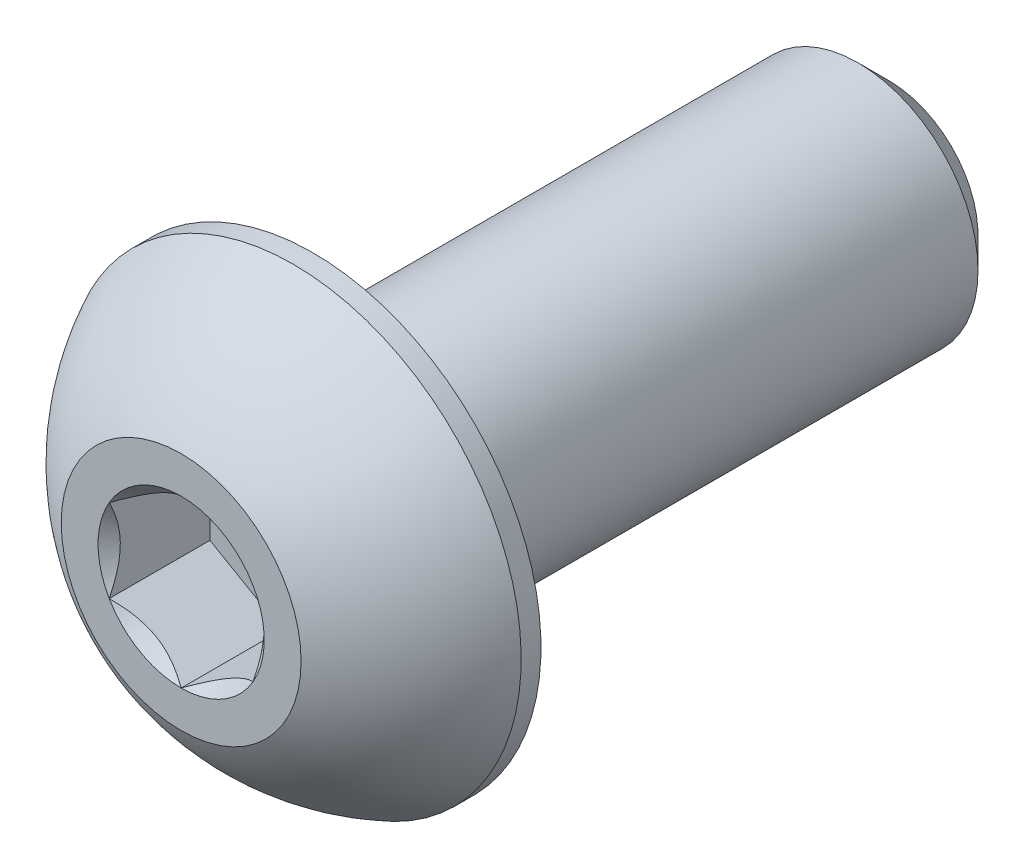
ISO-10303-21;
HEADER;
FILE_DESCRIPTION(('STEP AP214'),'2;1');
FILE_NAME('part.step','',(''),(''),'','','');
FILE_SCHEMA(('AUTOMOTIVE_DESIGN { 1 0 10303 214 1 1 1 1 }'));
ENDSEC;
DATA;
#1=APPLICATION_CONTEXT('core data for automotive mechanical design processes');
#2=APPLICATION_PROTOCOL_DEFINITION('international standard','automotive_design',2000,#1);
#3=PRODUCT_CONTEXT('',#1,'mechanical');
#4=PRODUCT('Part','Part','',(#3));
#5=PRODUCT_RELATED_PRODUCT_CATEGORY('part','',(#4));
#6=PRODUCT_DEFINITION_FORMATION('','',#4);
#7=PRODUCT_DEFINITION_CONTEXT('part definition',#1,'design');
#8=PRODUCT_DEFINITION('design','',#6,#7);
#9=PRODUCT_DEFINITION_SHAPE('','',#8);
#10=(LENGTH_UNIT() NAMED_UNIT(*) SI_UNIT(.MILLI.,.METRE.));
#11=(NAMED_UNIT(*) PLANE_ANGLE_UNIT() SI_UNIT($,.RADIAN.));
#12=(NAMED_UNIT(*) SI_UNIT($,.STERADIAN.) SOLID_ANGLE_UNIT());
#13=UNCERTAINTY_MEASURE_WITH_UNIT(LENGTH_MEASURE(1.E-05),#10,'distance_accuracy_value','');
#14=(GEOMETRIC_REPRESENTATION_CONTEXT(3) GLOBAL_UNCERTAINTY_ASSIGNED_CONTEXT((#13)) GLOBAL_UNIT_ASSIGNED_CONTEXT((#10,
#11,#12)) REPRESENTATION_CONTEXT('',''));
#15=CARTESIAN_POINT('',(0.,0.,0.));
#16=DIRECTION('',(0.,0.,1.));
#17=DIRECTION('',(1.,0.,0.));
#18=AXIS2_PLACEMENT_3D('',#15,#16,#17);
#19=CARTESIAN_POINT('',(1.5,0.866025403784439,5.275));
#20=DIRECTION('',(0.5,0.866025403784439,0.));
#21=DIRECTION('',(0.,0.,-1.));
#22=AXIS2_PLACEMENT_3D('',#19,#20,#21);
#23=PLANE('',#22);
#24=DIRECTION('',(0.,0.,1.));
#25=VECTOR('',#24,1.);
#26=CARTESIAN_POINT('',(1.5,0.866025403784439,5.275));
#27=LINE('',#26,#25);
#28=CARTESIAN_POINT('',(1.5,0.866025403784439,5.275));
#29=VERTEX_POINT('',#28);
#30=CARTESIAN_POINT('',(1.5,0.866025403784439,7.375));
#31=VERTEX_POINT('',#30);
#32=EDGE_CURVE('E11',#29,#31,#27,.T.);
#33=ORIENTED_EDGE('',*,*,#32,.T.);
#34=CARTESIAN_POINT('',(1.5,0.866025403784439,7.375));
#35=CARTESIAN_POINT('',(0.749999999999999,1.29903810567666,6.94198729810777));
#36=CARTESIAN_POINT('',(0.,1.73205080756888,7.375));
#37=(BOUNDED_CURVE() B_SPLINE_CURVE(2,(#34,#35,#36),.UNSPECIFIED.,.F.,
.F.) B_SPLINE_CURVE_WITH_KNOTS((3,3),(-0.388312804292311,-0.130611113351457),
.UNSPECIFIED.) CURVE() GEOMETRIC_REPRESENTATION_ITEM() RATIONAL_B_SPLINE_CURVE((1.30940107675851,
1.51196612828742,1.30940107675851)) REPRESENTATION_ITEM(''));
#38=CARTESIAN_POINT('',(0.,1.73205080756888,7.375));
#39=VERTEX_POINT('',#38);
#40=EDGE_CURVE('E122',#31,#39,#37,.T.);
#41=ORIENTED_EDGE('',*,*,#40,.T.);
#42=DIRECTION('',(0.,0.,1.));
#43=VECTOR('',#42,1.);
#44=CARTESIAN_POINT('',(0.,1.73205080756888,5.275));
#45=LINE('',#44,#43);
#46=CARTESIAN_POINT('',(0.,1.73205080756888,5.275));
#47=VERTEX_POINT('',#46);
#48=EDGE_CURVE('E261',#47,#39,#45,.T.);
#49=ORIENTED_EDGE('',*,*,#48,.F.);
#50=DIRECTION('',(-0.866025403784439,0.5,0.));
#51=VECTOR('',#50,1.);
#52=CARTESIAN_POINT('',(1.5,0.866025403784439,5.275));
#53=LINE('',#52,#51);
#54=EDGE_CURVE('E237',#29,#47,#53,.T.);
#55=ORIENTED_EDGE('',*,*,#54,.F.);
#56=EDGE_LOOP('',(#33,#41,#49,#55));
#57=FACE_BOUND('',#56,.T.);
#58=ADVANCED_FACE('F17',(#57),#23,.F.);
#59=CARTESIAN_POINT('',(1.5,-0.866025403784439,5.275));
#60=DIRECTION('',(1.,0.,0.));
#61=DIRECTION('',(0.,-1.,0.));
#62=AXIS2_PLACEMENT_3D('',#59,#60,#61);
#63=PLANE('',#62);
#64=DIRECTION('',(0.,0.,1.));
#65=VECTOR('',#64,1.);
#66=CARTESIAN_POINT('',(1.5,-0.866025403784439,5.275));
#67=LINE('',#66,#65);
#68=CARTESIAN_POINT('',(1.5,-0.866025403784439,5.275));
#69=VERTEX_POINT('',#68);
#70=CARTESIAN_POINT('',(1.5,-0.866025403784439,7.375));
#71=VERTEX_POINT('',#70);
#72=EDGE_CURVE('E20',#69,#71,#67,.T.);
#73=ORIENTED_EDGE('',*,*,#72,.T.);
#74=CARTESIAN_POINT('',(1.5,-0.86602540378444,7.375));
#75=CARTESIAN_POINT('',(1.5,0.,6.94198729810777));
#76=CARTESIAN_POINT('',(1.5,0.86602540378444,7.375));
#77=(BOUNDED_CURVE() B_SPLINE_CURVE(2,(#74,#75,#76),.UNSPECIFIED.,.F.,
.F.) B_SPLINE_CURVE_WITH_KNOTS((3,3),(-0.388312804292312,-0.130611113351457),
.UNSPECIFIED.) CURVE() GEOMETRIC_REPRESENTATION_ITEM() RATIONAL_B_SPLINE_CURVE((1.3094010767585,
1.51196612828742,1.3094010767585)) REPRESENTATION_ITEM(''));
#78=EDGE_CURVE('E111',#71,#31,#77,.T.);
#79=ORIENTED_EDGE('',*,*,#78,.T.);
#80=ORIENTED_EDGE('',*,*,#32,.F.);
#81=DIRECTION('',(0.,1.,0.));
#82=VECTOR('',#81,1.);
#83=CARTESIAN_POINT('',(1.5,-0.866025403784439,5.275));
#84=LINE('',#83,#82);
#85=EDGE_CURVE('E113',#69,#29,#84,.T.);
#86=ORIENTED_EDGE('',*,*,#85,.F.);
#87=EDGE_LOOP('',(#73,#79,#80,#86));
#88=FACE_BOUND('',#87,.T.);
#89=ADVANCED_FACE('F109',(#88),#63,.F.);
#90=CARTESIAN_POINT('',(0.,-1.73205080756888,5.275));
#91=DIRECTION('',(0.5,-0.866025403784439,0.));
#92=DIRECTION('',(0.,0.,-1.));
#93=AXIS2_PLACEMENT_3D('',#90,#91,#92);
#94=PLANE('',#93);
#95=DIRECTION('',(0.,0.,1.));
#96=VECTOR('',#95,1.);
#97=CARTESIAN_POINT('',(0.,-1.73205080756888,5.275));
#98=LINE('',#97,#96);
#99=CARTESIAN_POINT('',(0.,-1.73205080756888,5.275));
#100=VERTEX_POINT('',#99);
#101=CARTESIAN_POINT('',(0.,-1.73205080756888,7.375));
#102=VERTEX_POINT('',#101);
#103=EDGE_CURVE('E47',#100,#102,#98,.T.);
#104=ORIENTED_EDGE('',*,*,#103,.T.);
#105=CARTESIAN_POINT('',(0.,-1.73205080756888,7.375));
#106=CARTESIAN_POINT('',(0.749999999999999,-1.29903810567666,6.94198729810777));
#107=CARTESIAN_POINT('',(1.5,-0.86602540378444,7.375));
#108=(BOUNDED_CURVE() B_SPLINE_CURVE(2,(#105,#106,#107),.UNSPECIFIED.,.F.,
.F.) B_SPLINE_CURVE_WITH_KNOTS((3,3),(-0.388312804292311,-0.130611113351457),
.UNSPECIFIED.) CURVE() GEOMETRIC_REPRESENTATION_ITEM() RATIONAL_B_SPLINE_CURVE((1.3094010767585,
1.51196612828742,1.3094010767585)) REPRESENTATION_ITEM(''));
#109=EDGE_CURVE('E117',#102,#71,#108,.T.);
#110=ORIENTED_EDGE('',*,*,#109,.T.);
#111=ORIENTED_EDGE('',*,*,#72,.F.);
#112=DIRECTION('',(0.866025403784439,0.5,0.));
#113=VECTOR('',#112,1.);
#114=CARTESIAN_POINT('',(0.,-1.73205080756888,5.275));
#115=LINE('',#114,#113);
#116=EDGE_CURVE('E256',#100,#69,#115,.T.);
#117=ORIENTED_EDGE('',*,*,#116,.F.);
#118=EDGE_LOOP('',(#104,#110,#111,#117));
#119=FACE_BOUND('',#118,.T.);
#120=ADVANCED_FACE('F119',(#119),#94,.F.);
#121=CARTESIAN_POINT('',(-1.5,-0.866025403784438,5.275));
#122=DIRECTION('',(-0.5,-0.866025403784439,0.));
#123=DIRECTION('',(-0.866025403784439,0.5,0.));
#124=AXIS2_PLACEMENT_3D('',#121,#122,#123);
#125=PLANE('',#124);
#126=DIRECTION('',(0.,0.,1.));
#127=VECTOR('',#126,1.);
#128=CARTESIAN_POINT('',(-1.5,-0.866025403784438,5.275));
#129=LINE('',#128,#127);
#130=CARTESIAN_POINT('',(-1.5,-0.866025403784438,5.275));
#131=VERTEX_POINT('',#130);
#132=CARTESIAN_POINT('',(-1.5,-0.866025403784439,7.375));
#133=VERTEX_POINT('',#132);
#134=EDGE_CURVE('E267',#131,#133,#129,.T.);
#135=ORIENTED_EDGE('',*,*,#134,.T.);
#136=CARTESIAN_POINT('',(-1.5,-0.866025403784438,7.375));
#137=CARTESIAN_POINT('',(-0.749999999999999,-1.29903810567666,6.94198729810777));
#138=CARTESIAN_POINT('',(0.,-1.73205080756888,7.375));
#139=(BOUNDED_CURVE() B_SPLINE_CURVE(2,(#136,#137,#138),.UNSPECIFIED.,.F.,
.F.) B_SPLINE_CURVE_WITH_KNOTS((3,3),(-0.388312804292311,-0.130611113351457),
.UNSPECIFIED.) CURVE() GEOMETRIC_REPRESENTATION_ITEM() RATIONAL_B_SPLINE_CURVE((1.30940107675851,
1.51196612828742,1.30940107675851)) REPRESENTATION_ITEM(''));
#140=EDGE_CURVE('E123',#133,#102,#139,.T.);
#141=ORIENTED_EDGE('',*,*,#140,.T.);
#142=ORIENTED_EDGE('',*,*,#103,.F.);
#143=DIRECTION('',(0.866025403784439,-0.5,0.));
#144=VECTOR('',#143,1.);
#145=CARTESIAN_POINT('',(-1.5,-0.866025403784438,5.275));
#146=LINE('',#145,#144);
#147=EDGE_CURVE('E252',#131,#100,#146,.T.);
#148=ORIENTED_EDGE('',*,*,#147,.F.);
#149=EDGE_LOOP('',(#135,#141,#142,#148));
#150=FACE_BOUND('',#149,.T.);
#151=ADVANCED_FACE('F479',(#150),#125,.F.);
#152=CARTESIAN_POINT('',(-1.5,0.866025403784439,5.275));
#153=DIRECTION('',(-1.,0.,0.));
#154=DIRECTION('',(0.,0.,1.));
#155=AXIS2_PLACEMENT_3D('',#152,#153,#154);
#156=PLANE('',#155);
#157=DIRECTION('',(0.,0.,1.));
#158=VECTOR('',#157,1.);
#159=CARTESIAN_POINT('',(-1.5,0.866025403784439,5.275));
#160=LINE('',#159,#158);
#161=CARTESIAN_POINT('',(-1.5,0.866025403784439,5.275));
#162=VERTEX_POINT('',#161);
#163=CARTESIAN_POINT('',(-1.5,0.866025403784439,7.375));
#164=VERTEX_POINT('',#163);
#165=EDGE_CURVE('E264',#162,#164,#160,.T.);
#166=ORIENTED_EDGE('',*,*,#165,.T.);
#167=CARTESIAN_POINT('',(-1.5,0.86602540378444,7.375));
#168=CARTESIAN_POINT('',(-1.5,0.,6.94198729810777));
#169=CARTESIAN_POINT('',(-1.5,-0.86602540378444,7.375));
#170=(BOUNDED_CURVE() B_SPLINE_CURVE(2,(#167,#168,#169),.UNSPECIFIED.,.F.,
.F.) B_SPLINE_CURVE_WITH_KNOTS((3,3),(-0.388312804292311,-0.130611113351457),
.UNSPECIFIED.) CURVE() GEOMETRIC_REPRESENTATION_ITEM() RATIONAL_B_SPLINE_CURVE((1.3094010767585,
1.51196612828742,1.3094010767585)) REPRESENTATION_ITEM(''));
#171=EDGE_CURVE('E176',#164,#133,#170,.T.);
#172=ORIENTED_EDGE('',*,*,#171,.T.);
#173=ORIENTED_EDGE('',*,*,#134,.F.);
#174=DIRECTION('',(0.,-1.,0.));
#175=VECTOR('',#174,1.);
#176=CARTESIAN_POINT('',(-1.5,0.866025403784439,5.275));
#177=LINE('',#176,#175);
#178=EDGE_CURVE('E248',#162,#131,#177,.T.);
#179=ORIENTED_EDGE('',*,*,#178,.F.);
#180=EDGE_LOOP('',(#166,#172,#173,#179));
#181=FACE_BOUND('',#180,.T.);
#182=ADVANCED_FACE('F473',(#181),#156,.F.);
#183=CARTESIAN_POINT('',(0.,1.73205080756888,5.275));
#184=DIRECTION('',(-0.5,0.866025403784439,0.));
#185=DIRECTION('',(0.,0.,1.));
#186=AXIS2_PLACEMENT_3D('',#183,#184,#185);
#187=PLANE('',#186);
#188=ORIENTED_EDGE('',*,*,#48,.T.);
#189=CARTESIAN_POINT('',(0.,1.73205080756888,7.375));
#190=CARTESIAN_POINT('',(-0.749999999999999,1.29903810567666,6.94198729810777));
#191=CARTESIAN_POINT('',(-1.5,0.86602540378444,7.375));
#192=(BOUNDED_CURVE() B_SPLINE_CURVE(2,(#189,#190,#191),.UNSPECIFIED.,.F.,
.F.) B_SPLINE_CURVE_WITH_KNOTS((3,3),(-0.388312804292311,-0.130611113351457),
.UNSPECIFIED.) CURVE() GEOMETRIC_REPRESENTATION_ITEM() RATIONAL_B_SPLINE_CURVE((1.3094010767585,
1.51196612828742,1.3094010767585)) REPRESENTATION_ITEM(''));
#193=EDGE_CURVE('E170',#39,#164,#192,.T.);
#194=ORIENTED_EDGE('',*,*,#193,.T.);
#195=ORIENTED_EDGE('',*,*,#165,.F.);
#196=DIRECTION('',(-0.866025403784439,-0.5,0.));
#197=VECTOR('',#196,1.);
#198=CARTESIAN_POINT('',(0.,1.73205080756888,5.275));
#199=LINE('',#198,#197);
#200=EDGE_CURVE('E244',#47,#162,#199,.T.);
#201=ORIENTED_EDGE('',*,*,#200,.F.);
#202=EDGE_LOOP('',(#188,#194,#195,#201));
#203=FACE_BOUND('',#202,.T.);
#204=ADVANCED_FACE('F478',(#203),#187,.F.);
#205=CARTESIAN_POINT('',(0.,0.,5.275));
#206=DIRECTION('',(0.,0.,1.));
#207=DIRECTION('',(1.,0.,0.));
#208=AXIS2_PLACEMENT_3D('',#205,#206,#207);
#209=PLANE('',#208);
#210=ORIENTED_EDGE('',*,*,#54,.T.);
#211=ORIENTED_EDGE('',*,*,#200,.T.);
#212=ORIENTED_EDGE('',*,*,#178,.T.);
#213=ORIENTED_EDGE('',*,*,#147,.T.);
#214=ORIENTED_EDGE('',*,*,#116,.T.);
#215=ORIENTED_EDGE('',*,*,#85,.T.);
#216=EDGE_LOOP('',(#210,#211,#212,#213,#214,#215));
#217=FACE_BOUND('',#216,.T.);
#218=ADVANCED_FACE('F504',(#217),#209,.T.);
#219=CARTESIAN_POINT('',(0.,0.,7.375));
#220=DIRECTION('',(0.,0.,1.));
#221=DIRECTION('',(1.,0.,0.));
#222=AXIS2_PLACEMENT_3D('',#219,#220,#221);
#223=CONICAL_SURFACE('',#222,1.73205080756888,0.78539816339745);
#224=CARTESIAN_POINT('',(0.,0.,7.375));
#225=DIRECTION('',(0.,0.,1.));
#226=DIRECTION('',(1.,0.,0.));
#227=AXIS2_PLACEMENT_3D('',#224,#225,#226);
#228=CIRCLE('',#227,1.73205080756888);
#229=EDGE_CURVE('E133',#31,#39,#228,.T.);
#230=ORIENTED_EDGE('',*,*,#229,.T.);
#231=ORIENTED_EDGE('',*,*,#40,.F.);
#232=EDGE_LOOP('',(#230,#231));
#233=FACE_BOUND('',#232,.T.);
#234=ADVANCED_FACE('F460',(#233),#223,.F.);
#235=CARTESIAN_POINT('',(0.,0.,7.375));
#236=DIRECTION('',(0.,0.,1.));
#237=DIRECTION('',(1.,0.,0.));
#238=AXIS2_PLACEMENT_3D('',#235,#236,#237);
#239=CONICAL_SURFACE('',#238,1.73205080756888,0.78539816339745);
#240=CARTESIAN_POINT('',(0.,0.,7.375));
#241=DIRECTION('',(0.,0.,1.));
#242=DIRECTION('',(1.,0.,0.));
#243=AXIS2_PLACEMENT_3D('',#240,#241,#242);
#244=CIRCLE('',#243,1.73205080756888);
#245=EDGE_CURVE('E126',#102,#71,#244,.T.);
#246=ORIENTED_EDGE('',*,*,#245,.T.);
#247=ORIENTED_EDGE('',*,*,#109,.F.);
#248=EDGE_LOOP('',(#246,#247));
#249=FACE_BOUND('',#248,.T.);
#250=ADVANCED_FACE('F128',(#249),#239,.F.);
#251=CARTESIAN_POINT('',(0.,0.,7.375));
#252=DIRECTION('',(0.,0.,1.));
#253=DIRECTION('',(1.,0.,0.));
#254=AXIS2_PLACEMENT_3D('',#251,#252,#253);
#255=CONICAL_SURFACE('',#254,1.73205080756888,0.78539816339745);
#256=CARTESIAN_POINT('',(0.,0.,7.375));
#257=DIRECTION('',(0.,0.,1.));
#258=DIRECTION('',(1.,0.,0.));
#259=AXIS2_PLACEMENT_3D('',#256,#257,#258);
#260=CIRCLE('',#259,1.73205080756888);
#261=EDGE_CURVE('E132',#133,#102,#260,.T.);
#262=ORIENTED_EDGE('',*,*,#261,.T.);
#263=ORIENTED_EDGE('',*,*,#140,.F.);
#264=EDGE_LOOP('',(#262,#263));
#265=FACE_BOUND('',#264,.T.);
#266=ADVANCED_FACE('F459',(#265),#255,.F.);
#267=CARTESIAN_POINT('',(0.,0.,7.375));
#268=DIRECTION('',(0.,0.,1.));
#269=DIRECTION('',(-1.,0.,0.));
#270=AXIS2_PLACEMENT_3D('',#267,#268,#269);
#271=CONICAL_SURFACE('',#270,1.73205080756888,0.78539816339745);
#272=CARTESIAN_POINT('',(0.,0.,7.375));
#273=DIRECTION('',(0.,0.,1.));
#274=DIRECTION('',(1.,0.,0.));
#275=AXIS2_PLACEMENT_3D('',#272,#273,#274);
#276=CIRCLE('',#275,1.73205080756888);
#277=EDGE_CURVE('E169',#164,#133,#276,.T.);
#278=ORIENTED_EDGE('',*,*,#277,.T.);
#279=ORIENTED_EDGE('',*,*,#171,.F.);
#280=EDGE_LOOP('',(#278,#279));
#281=FACE_BOUND('',#280,.T.);
#282=ADVANCED_FACE('F489',(#281),#271,.F.);
#283=CARTESIAN_POINT('',(0.,0.,7.375));
#284=DIRECTION('',(0.,0.,1.));
#285=DIRECTION('',(1.,0.,0.));
#286=AXIS2_PLACEMENT_3D('',#283,#284,#285);
#287=CONICAL_SURFACE('',#286,1.73205080756888,0.78539816339745);
#288=CARTESIAN_POINT('',(0.,0.,7.375));
#289=DIRECTION('',(0.,0.,1.));
#290=DIRECTION('',(1.,0.,0.));
#291=AXIS2_PLACEMENT_3D('',#288,#289,#290);
#292=CIRCLE('',#291,1.73205080756888);
#293=EDGE_CURVE('E161',#39,#164,#292,.T.);
#294=ORIENTED_EDGE('',*,*,#293,.T.);
#295=ORIENTED_EDGE('',*,*,#193,.F.);
#296=EDGE_LOOP('',(#294,#295));
#297=FACE_BOUND('',#296,.T.);
#298=ADVANCED_FACE('F513',(#297),#287,.F.);
#299=CARTESIAN_POINT('',(0.,0.,-7.375));
#300=DIRECTION('',(0.,0.,1.));
#301=DIRECTION('',(1.,0.,0.));
#302=AXIS2_PLACEMENT_3D('',#299,#300,#301);
#303=PLANE('',#302);
#304=CARTESIAN_POINT('',(0.,0.,-7.375));
#305=DIRECTION('',(0.,0.,1.));
#306=DIRECTION('',(1.,0.,0.));
#307=AXIS2_PLACEMENT_3D('',#304,#305,#306);
#308=CIRCLE('',#307,1.86);
#309=CARTESIAN_POINT('',(-1.86,0.,-7.375));
#310=VERTEX_POINT('',#309);
#311=EDGE_CURVE('E185',#310,#310,#308,.T.);
#312=ORIENTED_EDGE('',*,*,#311,.F.);
#313=EDGE_LOOP('',(#312));
#314=FACE_BOUND('',#313,.T.);
#315=ADVANCED_FACE('F430',(#314),#303,.F.);
#316=CARTESIAN_POINT('',(0.,2.5,4.625));
#317=DIRECTION('',(0.,0.,1.));
#318=DIRECTION('',(1.,0.,0.));
#319=AXIS2_PLACEMENT_3D('',#316,#317,#318);
#320=PLANE('',#319);
#321=CARTESIAN_POINT('',(0.,0.,4.625));
#322=DIRECTION('',(0.,0.,1.));
#323=DIRECTION('',(1.,0.,0.));
#324=AXIS2_PLACEMENT_3D('',#321,#322,#323);
#325=CIRCLE('',#324,2.5);
#326=CARTESIAN_POINT('',(-2.5,0.,4.625));
#327=VERTEX_POINT('',#326);
#328=EDGE_CURVE('E177',#327,#327,#325,.T.);
#329=ORIENTED_EDGE('',*,*,#328,.T.);
#330=EDGE_LOOP('',(#329));
#331=FACE_BOUND('',#330,.T.);
#332=CARTESIAN_POINT('',(0.,0.,4.625));
#333=DIRECTION('',(0.,0.,1.));
#334=DIRECTION('',(1.,0.,0.));
#335=AXIS2_PLACEMENT_3D('',#332,#333,#334);
#336=CIRCLE('',#335,4.75);
#337=CARTESIAN_POINT('',(-4.75,0.,4.625));
#338=VERTEX_POINT('',#337);
#339=EDGE_CURVE('E192',#338,#338,#336,.T.);
#340=ORIENTED_EDGE('',*,*,#339,.F.);
#341=EDGE_LOOP('',(#340));
#342=FACE_BOUND('',#341,.T.);
#343=ADVANCED_FACE('F425',(#331,#342),#320,.F.);
#344=CARTESIAN_POINT('',(0.,0.,7.375));
#345=DIRECTION('',(0.,0.,-1.));
#346=DIRECTION('',(0.,-1.,0.));
#347=AXIS2_PLACEMENT_3D('',#344,#345,#346);
#348=PLANE('',#347);
#349=ORIENTED_EDGE('',*,*,#277,.F.);
#350=ORIENTED_EDGE('',*,*,#293,.F.);
#351=ORIENTED_EDGE('',*,*,#229,.F.);
#352=CARTESIAN_POINT('',(0.,0.,7.375));
#353=DIRECTION('',(0.,0.,1.));
#354=DIRECTION('',(1.,0.,0.));
#355=AXIS2_PLACEMENT_3D('',#352,#353,#354);
#356=CIRCLE('',#355,1.73205080756888);
#357=EDGE_CURVE('E137',#71,#31,#356,.T.);
#358=ORIENTED_EDGE('',*,*,#357,.F.);
#359=ORIENTED_EDGE('',*,*,#245,.F.);
#360=ORIENTED_EDGE('',*,*,#261,.F.);
#361=EDGE_LOOP('',(#349,#350,#351,#358,#359,#360));
#362=FACE_BOUND('',#361,.T.);
#363=CARTESIAN_POINT('',(0.,0.,7.375));
#364=DIRECTION('',(0.,0.,1.));
#365=DIRECTION('',(1.,0.,0.));
#366=AXIS2_PLACEMENT_3D('',#363,#364,#365);
#367=CIRCLE('',#366,2.5);
#368=CARTESIAN_POINT('',(0.,2.5,7.375));
#369=VERTEX_POINT('',#368);
#370=EDGE_CURVE('E189',#369,#369,#367,.T.);
#371=ORIENTED_EDGE('',*,*,#370,.T.);
#372=EDGE_LOOP('',(#371));
#373=FACE_BOUND('',#372,.T.);
#374=ADVANCED_FACE('F139',(#362,#373),#348,.F.);
#375=CARTESIAN_POINT('',(0.,0.,2.71694518716577));
#376=DIRECTION('',(-1.,0.,0.));
#377=DIRECTION('',(0.,1.,0.));
#378=AXIS2_PLACEMENT_3D('',#375,#376,#377);
#379=SPHERICAL_SURFACE('',#378,5.28653711226622);
#380=CARTESIAN_POINT('',(0.,0.,2.71694518716577));
#381=DIRECTION('',(0.,0.,1.));
#382=DIRECTION('',(1.,0.,0.));
#383=AXIS2_PLACEMENT_3D('',#380,#381,#382);
#384=SPHERICAL_SURFACE('',#383,5.28653711226622);
#385=ORIENTED_EDGE('',*,*,#370,.F.);
#386=EDGE_LOOP('',(#385));
#387=FACE_BOUND('',#386,.T.);
#388=CARTESIAN_POINT('',(0.,0.,5.0375));
#389=DIRECTION('',(0.,0.,1.));
#390=DIRECTION('',(1.,0.,0.));
#391=AXIS2_PLACEMENT_3D('',#388,#389,#390);
#392=CIRCLE('',#391,4.75);
#393=CARTESIAN_POINT('',(-4.75,0.,5.0375));
#394=VERTEX_POINT('',#393);
#395=EDGE_CURVE('E200',#394,#394,#392,.T.);
#396=ORIENTED_EDGE('',*,*,#395,.T.);
#397=EDGE_LOOP('',(#396));
#398=FACE_BOUND('',#397,.T.);
#399=ADVANCED_FACE('F449',(#387,#398),#384,.T.);
#400=CARTESIAN_POINT('',(0.,0.,7.375));
#401=DIRECTION('',(0.,0.,1.));
#402=DIRECTION('',(1.,0.,0.));
#403=AXIS2_PLACEMENT_3D('',#400,#401,#402);
#404=CYLINDRICAL_SURFACE('',#403,4.75);
#405=ORIENTED_EDGE('',*,*,#395,.F.);
#406=DIRECTION('',(0.,0.,-1.));
#407=VECTOR('',#406,1.);
#408=CARTESIAN_POINT('',(-4.75,0.,7.375));
#409=LINE('',#408,#407);
#410=EDGE_CURVE('E195',#394,#338,#409,.T.);
#411=ORIENTED_EDGE('',*,*,#410,.T.);
#412=ORIENTED_EDGE('',*,*,#339,.T.);
#413=ORIENTED_EDGE('',*,*,#410,.F.);
#414=EDGE_LOOP('',(#405,#411,#412,#413));
#415=FACE_BOUND('',#414,.T.);
#416=ADVANCED_FACE('F440',(#415),#404,.T.);
#417=CARTESIAN_POINT('',(0.,0.,7.375));
#418=DIRECTION('',(0.,0.,1.));
#419=DIRECTION('',(1.,0.,0.));
#420=AXIS2_PLACEMENT_3D('',#417,#418,#419);
#421=CYLINDRICAL_SURFACE('',#420,2.5);
#422=ORIENTED_EDGE('',*,*,#328,.F.);
#423=DIRECTION('',(0.,0.,-1.));
#424=VECTOR('',#423,1.);
#425=CARTESIAN_POINT('',(-2.5,0.,7.375));
#426=LINE('',#425,#424);
#427=CARTESIAN_POINT('',(-2.5,0.,-6.735));
#428=VERTEX_POINT('',#427);
#429=EDGE_CURVE('E184',#327,#428,#426,.T.);
#430=ORIENTED_EDGE('',*,*,#429,.T.);
#431=CARTESIAN_POINT('',(0.,0.,-6.735));
#432=DIRECTION('',(0.,0.,1.));
#433=DIRECTION('',(1.,0.,0.));
#434=AXIS2_PLACEMENT_3D('',#431,#432,#433);
#435=CIRCLE('',#434,2.5);
#436=EDGE_CURVE('E145',#428,#428,#435,.T.);
#437=ORIENTED_EDGE('',*,*,#436,.T.);
#438=ORIENTED_EDGE('',*,*,#429,.F.);
#439=EDGE_LOOP('',(#422,#430,#437,#438));
#440=FACE_BOUND('',#439,.T.);
#441=ADVANCED_FACE('F419',(#440),#421,.T.);
#442=CARTESIAN_POINT('',(0.,0.,-7.375));
#443=DIRECTION('',(0.,0.,1.));
#444=DIRECTION('',(1.,0.,0.));
#445=AXIS2_PLACEMENT_3D('',#442,#443,#444);
#446=CONICAL_SURFACE('',#445,1.86,0.785398163397442);
#447=ORIENTED_EDGE('',*,*,#436,.F.);
#448=DIRECTION('',(0.707106781186543,0.,-0.707106781186552));
#449=VECTOR('',#448,1.);
#450=CARTESIAN_POINT('',(-1.86,0.,-7.375));
#451=LINE('',#450,#449);
#452=EDGE_CURVE('E165',#428,#310,#451,.T.);
#453=ORIENTED_EDGE('',*,*,#452,.T.);
#454=ORIENTED_EDGE('',*,*,#311,.T.);
#455=ORIENTED_EDGE('',*,*,#452,.F.);
#456=EDGE_LOOP('',(#447,#453,#454,#455));
#457=FACE_BOUND('',#456,.T.);
#458=ADVANCED_FACE('F411',(#457),#446,.T.);
#459=CARTESIAN_POINT('',(0.,0.,7.375));
#460=DIRECTION('',(0.,0.,1.));
#461=DIRECTION('',(1.,0.,0.));
#462=AXIS2_PLACEMENT_3D('',#459,#460,#461);
#463=CONICAL_SURFACE('',#462,1.73205080756888,0.78539816339745);
#464=ORIENTED_EDGE('',*,*,#78,.F.);
#465=ORIENTED_EDGE('',*,*,#357,.T.);
#466=EDGE_LOOP('',(#464,#465));
#467=FACE_BOUND('',#466,.T.);
#468=ADVANCED_FACE('F147',(#467),#463,.F.);
#469=CLOSED_SHELL('',(#58,#89,#120,#151,#182,#204,#218,#234,#250,#266,#282,#298,#315,#343,#374,
#399,#416,#441,#458,#468));
#470=MANIFOLD_SOLID_BREP('B1',#469);
#471=ADVANCED_BREP_SHAPE_REPRESENTATION('',(#18,#470),#14);
#472=SHAPE_DEFINITION_REPRESENTATION(#9,#471);
ENDSEC;
END-ISO-10303-21;
